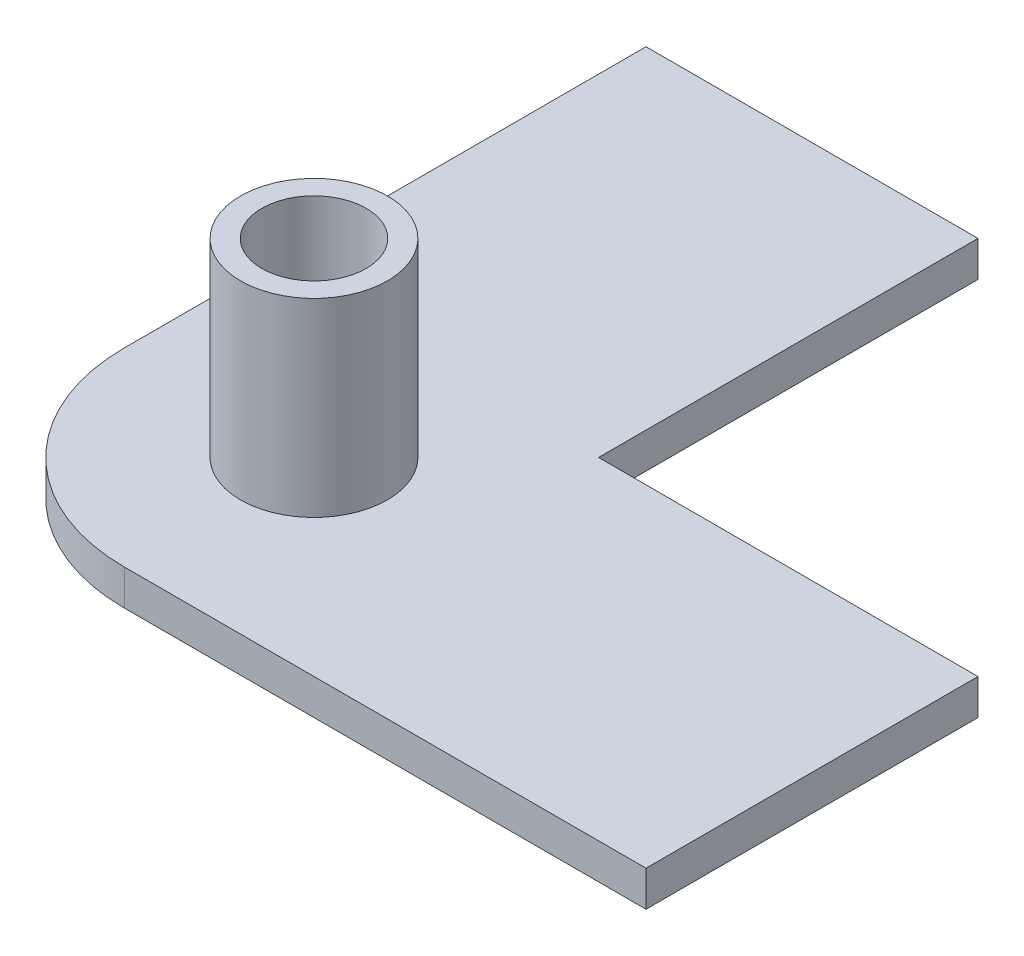
ISO-10303-21;
HEADER;
FILE_DESCRIPTION(('STEP AP214'),'2;1');
FILE_NAME('part.step','',(''),(''),'','','');
FILE_SCHEMA(('AUTOMOTIVE_DESIGN { 1 0 10303 214 1 1 1 1 }'));
ENDSEC;
DATA;
#1=APPLICATION_CONTEXT('core data for automotive mechanical design processes');
#2=APPLICATION_PROTOCOL_DEFINITION('international standard','automotive_design',2000,#1);
#3=PRODUCT_CONTEXT('',#1,'mechanical');
#4=PRODUCT('Part','Part','',(#3));
#5=PRODUCT_RELATED_PRODUCT_CATEGORY('part','',(#4));
#6=PRODUCT_DEFINITION_FORMATION('','',#4);
#7=PRODUCT_DEFINITION_CONTEXT('part definition',#1,'design');
#8=PRODUCT_DEFINITION('design','',#6,#7);
#9=PRODUCT_DEFINITION_SHAPE('','',#8);
#10=(LENGTH_UNIT() NAMED_UNIT(*) SI_UNIT(.MILLI.,.METRE.));
#11=(NAMED_UNIT(*) PLANE_ANGLE_UNIT() SI_UNIT($,.RADIAN.));
#12=(NAMED_UNIT(*) SI_UNIT($,.STERADIAN.) SOLID_ANGLE_UNIT());
#13=UNCERTAINTY_MEASURE_WITH_UNIT(LENGTH_MEASURE(1.E-05),#10,'distance_accuracy_value','');
#14=(GEOMETRIC_REPRESENTATION_CONTEXT(3) GLOBAL_UNCERTAINTY_ASSIGNED_CONTEXT((#13)) GLOBAL_UNIT_ASSIGNED_CONTEXT((#10,
#11,#12)) REPRESENTATION_CONTEXT('',''));
#15=CARTESIAN_POINT('',(0.,0.,0.));
#16=DIRECTION('',(0.,0.,1.));
#17=DIRECTION('',(1.,0.,0.));
#18=AXIS2_PLACEMENT_3D('',#15,#16,#17);
#19=CARTESIAN_POINT('',(0.,0.75,0.));
#20=DIRECTION('',(0.,1.,0.));
#21=DIRECTION('',(0.,0.,1.));
#22=AXIS2_PLACEMENT_3D('',#19,#20,#21);
#23=PLANE('',#22);
#24=DIRECTION('',(1.,0.,0.));
#25=VECTOR('',#24,1.);
#26=CARTESIAN_POINT('',(0.,0.75,3.99967418048264));
#27=LINE('',#26,#25);
#28=CARTESIAN_POINT('',(0.,0.75,3.99967418048264));
#29=VERTEX_POINT('',#28);
#30=CARTESIAN_POINT('',(11.,0.75,3.99967418048264));
#31=VERTEX_POINT('',#30);
#32=EDGE_CURVE('E167',#29,#31,#27,.T.);
#33=ORIENTED_EDGE('',*,*,#32,.T.);
#34=DIRECTION('',(0.,0.,-1.));
#35=VECTOR('',#34,1.);
#36=CARTESIAN_POINT('',(11.,0.75,0.));
#37=LINE('',#36,#35);
#38=CARTESIAN_POINT('',(11.,0.75,-3.));
#39=VERTEX_POINT('',#38);
#40=EDGE_CURVE('E94',#31,#39,#37,.T.);
#41=ORIENTED_EDGE('',*,*,#40,.T.);
#42=DIRECTION('',(1.,0.,0.));
#43=VECTOR('',#42,1.);
#44=CARTESIAN_POINT('',(0.,0.75,-3.));
#45=LINE('',#44,#43);
#46=CARTESIAN_POINT('',(3.,0.75,-3.));
#47=VERTEX_POINT('',#46);
#48=EDGE_CURVE('E181',#47,#39,#45,.T.);
#49=ORIENTED_EDGE('',*,*,#48,.F.);
#50=DIRECTION('',(0.,0.,1.));
#51=VECTOR('',#50,1.);
#52=CARTESIAN_POINT('',(3.,0.75,0.));
#53=LINE('',#52,#51);
#54=CARTESIAN_POINT('',(3.,0.75,-11.));
#55=VERTEX_POINT('',#54);
#56=EDGE_CURVE('E127',#55,#47,#53,.T.);
#57=ORIENTED_EDGE('',*,*,#56,.F.);
#58=DIRECTION('',(1.,0.,0.));
#59=VECTOR('',#58,1.);
#60=CARTESIAN_POINT('',(0.,0.75,-11.));
#61=LINE('',#60,#59);
#62=CARTESIAN_POINT('',(-3.99967418048264,0.75,-11.));
#63=VERTEX_POINT('',#62);
#64=EDGE_CURVE('E110',#63,#55,#61,.T.);
#65=ORIENTED_EDGE('',*,*,#64,.F.);
#66=DIRECTION('',(0.,0.,-1.));
#67=VECTOR('',#66,1.);
#68=CARTESIAN_POINT('',(-3.99967418048264,0.75,0.));
#69=LINE('',#68,#67);
#70=CARTESIAN_POINT('',(-3.99967418048264,0.75,0.));
#71=VERTEX_POINT('',#70);
#72=EDGE_CURVE('E124',#71,#63,#69,.T.);
#73=ORIENTED_EDGE('',*,*,#72,.F.);
#74=CARTESIAN_POINT('',(0.,0.75,0.));
#75=DIRECTION('',(0.,1.,0.));
#76=DIRECTION('',(0.,0.,1.));
#77=AXIS2_PLACEMENT_3D('',#74,#75,#76);
#78=CIRCLE('',#77,3.99967418048264);
#79=EDGE_CURVE('E132',#29,#71,#78,.F.);
#80=ORIENTED_EDGE('',*,*,#79,.F.);
#81=EDGE_LOOP('',(#33,#41,#49,#57,#65,#73,#80));
#82=FACE_BOUND('',#81,.T.);
#83=CARTESIAN_POINT('',(0.,0.75,0.));
#84=DIRECTION('',(0.,1.,0.));
#85=DIRECTION('',(0.,0.,1.));
#86=AXIS2_PLACEMENT_3D('',#83,#84,#85);
#87=CIRCLE('',#86,1.55);
#88=CARTESIAN_POINT('',(0.,0.75,1.55));
#89=VERTEX_POINT('',#88);
#90=EDGE_CURVE('E198',#89,#89,#87,.T.);
#91=ORIENTED_EDGE('',*,*,#90,.F.);
#92=EDGE_LOOP('',(#91));
#93=FACE_BOUND('',#92,.T.);
#94=ADVANCED_FACE('F41',(#82,#93),#23,.T.);
#95=CARTESIAN_POINT('',(0.,0.75,3.99967418048264));
#96=DIRECTION('',(0.,0.,-1.));
#97=DIRECTION('',(-1.,0.,0.));
#98=AXIS2_PLACEMENT_3D('',#95,#96,#97);
#99=PLANE('',#98);
#100=DIRECTION('',(1.,0.,0.));
#101=VECTOR('',#100,1.);
#102=CARTESIAN_POINT('',(0.,0.,3.99967418048264));
#103=LINE('',#102,#101);
#104=CARTESIAN_POINT('',(0.,0.,3.99967418048264));
#105=VERTEX_POINT('',#104);
#106=CARTESIAN_POINT('',(11.,0.,3.99967418048264));
#107=VERTEX_POINT('',#106);
#108=EDGE_CURVE('E138',#105,#107,#103,.T.);
#109=ORIENTED_EDGE('',*,*,#108,.T.);
#110=DIRECTION('',(0.,-1.,0.));
#111=VECTOR('',#110,1.);
#112=CARTESIAN_POINT('',(11.,0.75,3.99967418048264));
#113=LINE('',#112,#111);
#114=EDGE_CURVE('E11',#31,#107,#113,.T.);
#115=ORIENTED_EDGE('',*,*,#114,.F.);
#116=ORIENTED_EDGE('',*,*,#32,.F.);
#117=DIRECTION('',(0.,-1.,0.));
#118=VECTOR('',#117,1.);
#119=CARTESIAN_POINT('',(0.,0.75,3.99967418048264));
#120=LINE('',#119,#118);
#121=EDGE_CURVE('E59',#29,#105,#120,.T.);
#122=ORIENTED_EDGE('',*,*,#121,.T.);
#123=EDGE_LOOP('',(#109,#115,#116,#122));
#124=FACE_BOUND('',#123,.T.);
#125=ADVANCED_FACE('F43',(#124),#99,.F.);
#126=CARTESIAN_POINT('',(11.,0.75,0.));
#127=DIRECTION('',(-1.,0.,0.));
#128=DIRECTION('',(0.,0.,1.));
#129=AXIS2_PLACEMENT_3D('',#126,#127,#128);
#130=PLANE('',#129);
#131=DIRECTION('',(0.,0.,-1.));
#132=VECTOR('',#131,1.);
#133=CARTESIAN_POINT('',(11.,0.,0.));
#134=LINE('',#133,#132);
#135=CARTESIAN_POINT('',(11.,0.,-3.));
#136=VERTEX_POINT('',#135);
#137=EDGE_CURVE('E141',#107,#136,#134,.T.);
#138=ORIENTED_EDGE('',*,*,#137,.T.);
#139=DIRECTION('',(0.,-1.,0.));
#140=VECTOR('',#139,1.);
#141=CARTESIAN_POINT('',(11.,0.75,-3.));
#142=LINE('',#141,#140);
#143=EDGE_CURVE('E51',#39,#136,#142,.T.);
#144=ORIENTED_EDGE('',*,*,#143,.F.);
#145=ORIENTED_EDGE('',*,*,#40,.F.);
#146=ORIENTED_EDGE('',*,*,#114,.T.);
#147=EDGE_LOOP('',(#138,#144,#145,#146));
#148=FACE_BOUND('',#147,.T.);
#149=ADVANCED_FACE('F182',(#148),#130,.F.);
#150=CARTESIAN_POINT('',(0.,0.75,-3.));
#151=DIRECTION('',(0.,0.,-1.));
#152=DIRECTION('',(-1.,0.,0.));
#153=AXIS2_PLACEMENT_3D('',#150,#151,#152);
#154=PLANE('',#153);
#155=DIRECTION('',(1.,0.,0.));
#156=VECTOR('',#155,1.);
#157=CARTESIAN_POINT('',(0.,0.,-3.));
#158=LINE('',#157,#156);
#159=CARTESIAN_POINT('',(3.,0.,-3.));
#160=VERTEX_POINT('',#159);
#161=EDGE_CURVE('E146',#160,#136,#158,.T.);
#162=ORIENTED_EDGE('',*,*,#161,.F.);
#163=DIRECTION('',(0.,-1.,0.));
#164=VECTOR('',#163,1.);
#165=CARTESIAN_POINT('',(3.,0.75,-3.));
#166=LINE('',#165,#164);
#167=EDGE_CURVE('E174',#47,#160,#166,.T.);
#168=ORIENTED_EDGE('',*,*,#167,.F.);
#169=ORIENTED_EDGE('',*,*,#48,.T.);
#170=ORIENTED_EDGE('',*,*,#143,.T.);
#171=EDGE_LOOP('',(#162,#168,#169,#170));
#172=FACE_BOUND('',#171,.T.);
#173=ADVANCED_FACE('F180',(#172),#154,.T.);
#174=CARTESIAN_POINT('',(3.,0.75,0.));
#175=DIRECTION('',(1.,0.,0.));
#176=DIRECTION('',(0.,0.,-1.));
#177=AXIS2_PLACEMENT_3D('',#174,#175,#176);
#178=PLANE('',#177);
#179=DIRECTION('',(0.,0.,1.));
#180=VECTOR('',#179,1.);
#181=CARTESIAN_POINT('',(3.,0.,0.));
#182=LINE('',#181,#180);
#183=CARTESIAN_POINT('',(3.,0.,-11.));
#184=VERTEX_POINT('',#183);
#185=EDGE_CURVE('E150',#184,#160,#182,.T.);
#186=ORIENTED_EDGE('',*,*,#185,.F.);
#187=DIRECTION('',(0.,-1.,0.));
#188=VECTOR('',#187,1.);
#189=CARTESIAN_POINT('',(3.,0.75,-11.));
#190=LINE('',#189,#188);
#191=EDGE_CURVE('E117',#55,#184,#190,.T.);
#192=ORIENTED_EDGE('',*,*,#191,.F.);
#193=ORIENTED_EDGE('',*,*,#56,.T.);
#194=ORIENTED_EDGE('',*,*,#167,.T.);
#195=EDGE_LOOP('',(#186,#192,#193,#194));
#196=FACE_BOUND('',#195,.T.);
#197=ADVANCED_FACE('F189',(#196),#178,.T.);
#198=CARTESIAN_POINT('',(0.,0.75,-11.));
#199=DIRECTION('',(0.,0.,-1.));
#200=DIRECTION('',(-1.,0.,0.));
#201=AXIS2_PLACEMENT_3D('',#198,#199,#200);
#202=PLANE('',#201);
#203=DIRECTION('',(1.,0.,0.));
#204=VECTOR('',#203,1.);
#205=CARTESIAN_POINT('',(0.,0.,-11.));
#206=LINE('',#205,#204);
#207=CARTESIAN_POINT('',(-3.99967418048264,0.,-11.));
#208=VERTEX_POINT('',#207);
#209=EDGE_CURVE('E112',#208,#184,#206,.T.);
#210=ORIENTED_EDGE('',*,*,#209,.F.);
#211=DIRECTION('',(0.,-1.,0.));
#212=VECTOR('',#211,1.);
#213=CARTESIAN_POINT('',(-3.99967418048264,0.75,-11.));
#214=LINE('',#213,#212);
#215=EDGE_CURVE('E107',#63,#208,#214,.T.);
#216=ORIENTED_EDGE('',*,*,#215,.F.);
#217=ORIENTED_EDGE('',*,*,#64,.T.);
#218=ORIENTED_EDGE('',*,*,#191,.T.);
#219=EDGE_LOOP('',(#210,#216,#217,#218));
#220=FACE_BOUND('',#219,.T.);
#221=ADVANCED_FACE('F109',(#220),#202,.T.);
#222=CARTESIAN_POINT('',(-3.99967418048264,0.75,0.));
#223=DIRECTION('',(-1.,0.,0.));
#224=DIRECTION('',(0.,0.,1.));
#225=AXIS2_PLACEMENT_3D('',#222,#223,#224);
#226=PLANE('',#225);
#227=DIRECTION('',(0.,0.,-1.));
#228=VECTOR('',#227,1.);
#229=CARTESIAN_POINT('',(-3.99967418048264,0.,0.));
#230=LINE('',#229,#228);
#231=CARTESIAN_POINT('',(-3.99967418048264,0.,0.));
#232=VERTEX_POINT('',#231);
#233=EDGE_CURVE('E156',#232,#208,#230,.T.);
#234=ORIENTED_EDGE('',*,*,#233,.F.);
#235=DIRECTION('',(0.,-1.,0.));
#236=VECTOR('',#235,1.);
#237=CARTESIAN_POINT('',(-3.99967418048264,0.75,0.));
#238=LINE('',#237,#236);
#239=EDGE_CURVE('E82',#71,#232,#238,.T.);
#240=ORIENTED_EDGE('',*,*,#239,.F.);
#241=ORIENTED_EDGE('',*,*,#72,.T.);
#242=ORIENTED_EDGE('',*,*,#215,.T.);
#243=EDGE_LOOP('',(#234,#240,#241,#242));
#244=FACE_BOUND('',#243,.T.);
#245=ADVANCED_FACE('F130',(#244),#226,.T.);
#246=CARTESIAN_POINT('',(0.,0.75,0.));
#247=DIRECTION('',(0.,-1.,0.));
#248=DIRECTION('',(0.,0.,-1.));
#249=AXIS2_PLACEMENT_3D('',#246,#247,#248);
#250=CYLINDRICAL_SURFACE('',#249,3.99967418048264);
#251=CARTESIAN_POINT('',(0.,0.,0.));
#252=DIRECTION('',(0.,1.,0.));
#253=DIRECTION('',(0.,0.,1.));
#254=AXIS2_PLACEMENT_3D('',#251,#252,#253);
#255=CIRCLE('',#254,3.99967418048264);
#256=EDGE_CURVE('E159',#105,#232,#255,.F.);
#257=ORIENTED_EDGE('',*,*,#256,.F.);
#258=ORIENTED_EDGE('',*,*,#121,.F.);
#259=ORIENTED_EDGE('',*,*,#79,.T.);
#260=ORIENTED_EDGE('',*,*,#239,.T.);
#261=EDGE_LOOP('',(#257,#258,#259,#260));
#262=FACE_BOUND('',#261,.T.);
#263=ADVANCED_FACE('F232',(#262),#250,.T.);
#264=CARTESIAN_POINT('',(0.,0.75,0.));
#265=DIRECTION('',(0.,-1.,0.));
#266=DIRECTION('',(0.,0.,-1.));
#267=AXIS2_PLACEMENT_3D('',#264,#265,#266);
#268=CYLINDRICAL_SURFACE('',#267,1.1);
#269=CARTESIAN_POINT('',(0.,0.,0.));
#270=DIRECTION('',(0.,1.,0.));
#271=DIRECTION('',(0.,0.,1.));
#272=AXIS2_PLACEMENT_3D('',#269,#270,#271);
#273=CIRCLE('',#272,1.1);
#274=CARTESIAN_POINT('',(0.,0.,1.1));
#275=VERTEX_POINT('',#274);
#276=EDGE_CURVE('E163',#275,#275,#273,.T.);
#277=ORIENTED_EDGE('',*,*,#276,.F.);
#278=EDGE_LOOP('',(#277));
#279=FACE_BOUND('',#278,.T.);
#280=CARTESIAN_POINT('',(0.,4.75,0.));
#281=DIRECTION('',(0.,1.,0.));
#282=DIRECTION('',(0.,0.,1.));
#283=AXIS2_PLACEMENT_3D('',#280,#281,#282);
#284=CIRCLE('',#283,1.1);
#285=CARTESIAN_POINT('',(0.,4.75,1.1));
#286=VERTEX_POINT('',#285);
#287=EDGE_CURVE('E202',#286,#286,#284,.T.);
#288=ORIENTED_EDGE('',*,*,#287,.T.);
#289=EDGE_LOOP('',(#288));
#290=FACE_BOUND('',#289,.T.);
#291=ADVANCED_FACE('F210',(#279,#290),#268,.F.);
#292=CARTESIAN_POINT('',(0.,0.,0.));
#293=DIRECTION('',(0.,1.,0.));
#294=DIRECTION('',(0.,0.,1.));
#295=AXIS2_PLACEMENT_3D('',#292,#293,#294);
#296=PLANE('',#295);
#297=ORIENTED_EDGE('',*,*,#108,.F.);
#298=ORIENTED_EDGE('',*,*,#256,.T.);
#299=ORIENTED_EDGE('',*,*,#233,.T.);
#300=ORIENTED_EDGE('',*,*,#209,.T.);
#301=ORIENTED_EDGE('',*,*,#185,.T.);
#302=ORIENTED_EDGE('',*,*,#161,.T.);
#303=ORIENTED_EDGE('',*,*,#137,.F.);
#304=EDGE_LOOP('',(#297,#298,#299,#300,#301,#302,#303));
#305=FACE_BOUND('',#304,.T.);
#306=ORIENTED_EDGE('',*,*,#276,.T.);
#307=EDGE_LOOP('',(#306));
#308=FACE_BOUND('',#307,.T.);
#309=ADVANCED_FACE('F185',(#305,#308),#296,.F.);
#310=CARTESIAN_POINT('',(0.,4.75,0.));
#311=DIRECTION('',(0.,1.,0.));
#312=DIRECTION('',(0.,0.,1.));
#313=AXIS2_PLACEMENT_3D('',#310,#311,#312);
#314=PLANE('',#313);
#315=CARTESIAN_POINT('',(0.,4.75,0.));
#316=DIRECTION('',(0.,1.,0.));
#317=DIRECTION('',(0.,0.,1.));
#318=AXIS2_PLACEMENT_3D('',#315,#316,#317);
#319=CIRCLE('',#318,1.55);
#320=CARTESIAN_POINT('',(0.,4.75,1.55));
#321=VERTEX_POINT('',#320);
#322=EDGE_CURVE('E142',#321,#321,#319,.T.);
#323=ORIENTED_EDGE('',*,*,#322,.T.);
#324=EDGE_LOOP('',(#323));
#325=FACE_BOUND('',#324,.T.);
#326=ORIENTED_EDGE('',*,*,#287,.F.);
#327=EDGE_LOOP('',(#326));
#328=FACE_BOUND('',#327,.T.);
#329=ADVANCED_FACE('F212',(#325,#328),#314,.T.);
#330=CARTESIAN_POINT('',(0.,4.75,0.));
#331=DIRECTION('',(0.,-1.,0.));
#332=DIRECTION('',(0.,0.,-1.));
#333=AXIS2_PLACEMENT_3D('',#330,#331,#332);
#334=CYLINDRICAL_SURFACE('',#333,1.55);
#335=ORIENTED_EDGE('',*,*,#322,.F.);
#336=EDGE_LOOP('',(#335));
#337=FACE_BOUND('',#336,.T.);
#338=ORIENTED_EDGE('',*,*,#90,.T.);
#339=EDGE_LOOP('',(#338));
#340=FACE_BOUND('',#339,.T.);
#341=ADVANCED_FACE('F214',(#337,#340),#334,.T.);
#342=CLOSED_SHELL('',(#94,#125,#149,#173,#197,#221,#245,#263,#291,#309,#329,#341));
#343=MANIFOLD_SOLID_BREP('B2',#342);
#344=ADVANCED_BREP_SHAPE_REPRESENTATION('',(#18,#343),#14);
#345=SHAPE_DEFINITION_REPRESENTATION(#9,#344);
ENDSEC;
END-ISO-10303-21;
